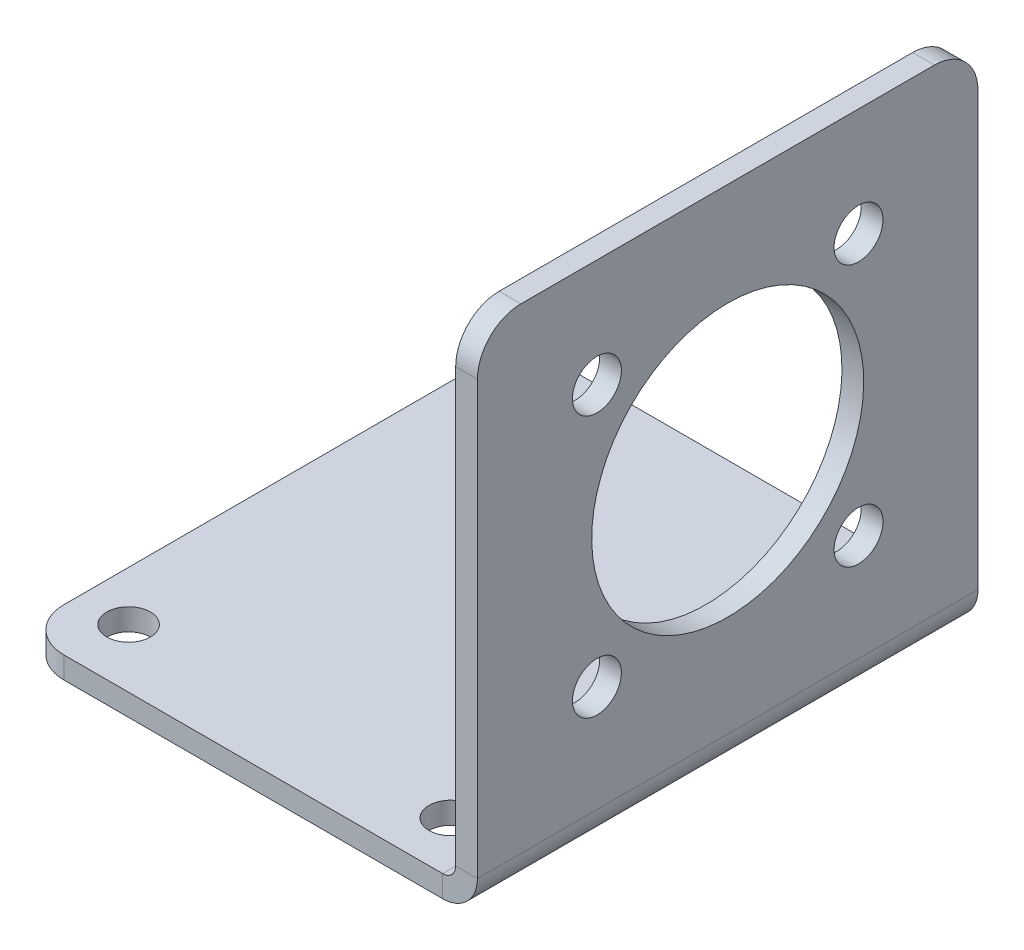
ISO-10303-21;
HEADER;
FILE_DESCRIPTION(('STEP AP214'),'2;1');
FILE_NAME('part.step','',(''),(''),'','','');
FILE_SCHEMA(('AUTOMOTIVE_DESIGN { 1 0 10303 214 1 1 1 1 }'));
ENDSEC;
DATA;
#1=APPLICATION_CONTEXT('core data for automotive mechanical design processes');
#2=APPLICATION_PROTOCOL_DEFINITION('international standard','automotive_design',2000,#1);
#3=PRODUCT_CONTEXT('',#1,'mechanical');
#4=PRODUCT('Part','Part','',(#3));
#5=PRODUCT_RELATED_PRODUCT_CATEGORY('part','',(#4));
#6=PRODUCT_DEFINITION_FORMATION('','',#4);
#7=PRODUCT_DEFINITION_CONTEXT('part definition',#1,'design');
#8=PRODUCT_DEFINITION('design','',#6,#7);
#9=PRODUCT_DEFINITION_SHAPE('','',#8);
#10=(LENGTH_UNIT() NAMED_UNIT(*) SI_UNIT(.MILLI.,.METRE.));
#11=(NAMED_UNIT(*) PLANE_ANGLE_UNIT() SI_UNIT($,.RADIAN.));
#12=(NAMED_UNIT(*) SI_UNIT($,.STERADIAN.) SOLID_ANGLE_UNIT());
#13=UNCERTAINTY_MEASURE_WITH_UNIT(LENGTH_MEASURE(1.E-05),#10,'distance_accuracy_value','');
#14=(GEOMETRIC_REPRESENTATION_CONTEXT(3) GLOBAL_UNCERTAINTY_ASSIGNED_CONTEXT((#13)) GLOBAL_UNIT_ASSIGNED_CONTEXT((#10,
#11,#12)) REPRESENTATION_CONTEXT('',''));
#15=CARTESIAN_POINT('',(0.,0.,0.));
#16=DIRECTION('',(0.,0.,1.));
#17=DIRECTION('',(1.,0.,0.));
#18=AXIS2_PLACEMENT_3D('',#15,#16,#17);
#19=CARTESIAN_POINT('',(20.0000000000001,-21.0557519189488,0.));
#20=DIRECTION('',(1.,0.,0.));
#21=DIRECTION('',(0.,0.,-1.));
#22=AXIS2_PLACEMENT_3D('',#19,#20,#21);
#23=PLANE('',#22);
#24=CARTESIAN_POINT('',(19.9999999999999,35.0208152801713,12.0208152801713));
#25=DIRECTION('',(1.,0.,0.));
#26=DIRECTION('',(0.,1.,0.));
#27=AXIS2_PLACEMENT_3D('',#24,#25,#26);
#28=CIRCLE('',#27,2.24999999999961);
#29=CARTESIAN_POINT('',(19.9999999999999,37.2708152801709,12.0208152801713));
#30=VERTEX_POINT('',#29);
#31=EDGE_CURVE('E336',#30,#30,#28,.T.);
#32=ORIENTED_EDGE('',*,*,#31,.T.);
#33=EDGE_LOOP('',(#32));
#34=FACE_BOUND('',#33,.T.);
#35=CARTESIAN_POINT('',(20.,10.9791847198287,12.0208152801713));
#36=DIRECTION('',(1.,0.,0.));
#37=DIRECTION('',(0.,1.,0.));
#38=AXIS2_PLACEMENT_3D('',#35,#36,#37);
#39=CIRCLE('',#38,2.24999999999793);
#40=CARTESIAN_POINT('',(20.,13.2291847198266,12.0208152801713));
#41=VERTEX_POINT('',#40);
#42=EDGE_CURVE('E310',#41,#41,#39,.T.);
#43=ORIENTED_EDGE('',*,*,#42,.T.);
#44=EDGE_LOOP('',(#43));
#45=FACE_BOUND('',#44,.T.);
#46=CARTESIAN_POINT('',(20.,10.9791847198287,-12.0208152801713));
#47=DIRECTION('',(1.,0.,0.));
#48=DIRECTION('',(0.,1.,0.));
#49=AXIS2_PLACEMENT_3D('',#46,#47,#48);
#50=CIRCLE('',#49,2.24999999999837);
#51=CARTESIAN_POINT('',(20.,13.2291847198271,-12.0208152801713));
#52=VERTEX_POINT('',#51);
#53=EDGE_CURVE('E305',#52,#52,#50,.T.);
#54=ORIENTED_EDGE('',*,*,#53,.T.);
#55=EDGE_LOOP('',(#54));
#56=FACE_BOUND('',#55,.T.);
#57=CARTESIAN_POINT('',(19.9999999999999,35.0208152801713,-12.0208152801713));
#58=DIRECTION('',(1.,0.,0.));
#59=DIRECTION('',(0.,1.,0.));
#60=AXIS2_PLACEMENT_3D('',#57,#58,#59);
#61=CIRCLE('',#60,2.24999999999994);
#62=CARTESIAN_POINT('',(19.9999999999999,37.2708152801713,-12.0208152801713));
#63=VERTEX_POINT('',#62);
#64=EDGE_CURVE('E298',#63,#63,#61,.T.);
#65=ORIENTED_EDGE('',*,*,#64,.T.);
#66=EDGE_LOOP('',(#65));
#67=FACE_BOUND('',#66,.T.);
#68=CARTESIAN_POINT('',(19.9999999999999,23.,0.));
#69=DIRECTION('',(1.,0.,0.));
#70=DIRECTION('',(0.,1.,0.));
#71=AXIS2_PLACEMENT_3D('',#68,#69,#70);
#72=CIRCLE('',#71,12.5);
#73=CARTESIAN_POINT('',(19.9999999999999,35.5,0.));
#74=VERTEX_POINT('',#73);
#75=EDGE_CURVE('E331',#74,#74,#72,.T.);
#76=ORIENTED_EDGE('',*,*,#75,.T.);
#77=EDGE_LOOP('',(#76));
#78=FACE_BOUND('',#77,.T.);
#79=DIRECTION('',(0.,0.,-1.));
#80=VECTOR('',#79,1.);
#81=CARTESIAN_POINT('',(19.9999999999999,44.9442480810512,-23.));
#82=LINE('',#81,#80);
#83=CARTESIAN_POINT('',(19.9999999999999,44.9442480810512,19.));
#84=VERTEX_POINT('',#83);
#85=CARTESIAN_POINT('',(19.9999999999999,44.9442480810512,-19.));
#86=VERTEX_POINT('',#85);
#87=EDGE_CURVE('E186',#84,#86,#82,.T.);
#88=ORIENTED_EDGE('',*,*,#87,.T.);
#89=CARTESIAN_POINT('',(19.9999999999999,40.9442480810512,-19.));
#90=DIRECTION('',(1.,0.,0.));
#91=DIRECTION('',(0.,1.,0.));
#92=AXIS2_PLACEMENT_3D('',#89,#90,#91);
#93=CIRCLE('',#92,4.);
#94=CARTESIAN_POINT('',(19.9999999999999,40.9442480810512,-23.));
#95=VERTEX_POINT('',#94);
#96=EDGE_CURVE('E264',#86,#95,#93,.F.);
#97=ORIENTED_EDGE('',*,*,#96,.T.);
#98=DIRECTION('',(0.,-1.,0.));
#99=VECTOR('',#98,1.);
#100=CARTESIAN_POINT('',(20.0000000000001,-41.0557519189488,-23.));
#101=LINE('',#100,#99);
#102=CARTESIAN_POINT('',(20.,1.2,-23.));
#103=VERTEX_POINT('',#102);
#104=EDGE_CURVE('E229',#95,#103,#101,.T.);
#105=ORIENTED_EDGE('',*,*,#104,.T.);
#106=DIRECTION('',(0.,0.,1.));
#107=VECTOR('',#106,1.);
#108=CARTESIAN_POINT('',(20.,1.2,0.));
#109=LINE('',#108,#107);
#110=CARTESIAN_POINT('',(20.,1.2,23.));
#111=VERTEX_POINT('',#110);
#112=EDGE_CURVE('E237',#103,#111,#109,.T.);
#113=ORIENTED_EDGE('',*,*,#112,.T.);
#114=DIRECTION('',(0.,1.,0.));
#115=VECTOR('',#114,1.);
#116=CARTESIAN_POINT('',(20.0000000000001,-41.0557519189488,23.));
#117=LINE('',#116,#115);
#118=CARTESIAN_POINT('',(19.9999999999999,40.9442480810512,23.));
#119=VERTEX_POINT('',#118);
#120=EDGE_CURVE('E246',#111,#119,#117,.T.);
#121=ORIENTED_EDGE('',*,*,#120,.T.);
#122=CARTESIAN_POINT('',(19.9999999999999,40.9442480810512,19.));
#123=DIRECTION('',(1.,0.,0.));
#124=DIRECTION('',(0.,1.,0.));
#125=AXIS2_PLACEMENT_3D('',#122,#123,#124);
#126=CIRCLE('',#125,4.);
#127=EDGE_CURVE('E261',#119,#84,#126,.F.);
#128=ORIENTED_EDGE('',*,*,#127,.T.);
#129=EDGE_LOOP('',(#88,#97,#105,#113,#121,#128));
#130=FACE_BOUND('',#129,.T.);
#131=ADVANCED_FACE('F61',(#34,#45,#56,#67,#78,#130),#23,.F.);
#132=CARTESIAN_POINT('',(22.0000000000002,-41.0557519189488,23.));
#133=DIRECTION('',(0.,0.,1.));
#134=DIRECTION('',(0.,1.,0.));
#135=AXIS2_PLACEMENT_3D('',#132,#133,#134);
#136=PLANE('',#135);
#137=DIRECTION('',(0.,1.,0.));
#138=VECTOR('',#137,1.);
#139=CARTESIAN_POINT('',(22.,-1.05575191894877,23.));
#140=LINE('',#139,#138);
#141=CARTESIAN_POINT('',(22.,1.20000000000001,23.));
#142=VERTEX_POINT('',#141);
#143=CARTESIAN_POINT('',(21.9999999999999,40.9442480810512,23.));
#144=VERTEX_POINT('',#143);
#145=EDGE_CURVE('E225',#142,#144,#140,.T.);
#146=ORIENTED_EDGE('',*,*,#145,.T.);
#147=DIRECTION('',(-1.,0.,0.));
#148=VECTOR('',#147,1.);
#149=CARTESIAN_POINT('',(21.9999999999999,40.9442480810512,23.));
#150=LINE('',#149,#148);
#151=EDGE_CURVE('E14',#144,#119,#150,.T.);
#152=ORIENTED_EDGE('',*,*,#151,.T.);
#153=ORIENTED_EDGE('',*,*,#120,.F.);
#154=DIRECTION('',(-1.,0.,0.));
#155=VECTOR('',#154,1.);
#156=CARTESIAN_POINT('',(22.,1.20000000000001,23.));
#157=LINE('',#156,#155);
#158=EDGE_CURVE('E233',#142,#111,#157,.T.);
#159=ORIENTED_EDGE('',*,*,#158,.F.);
#160=EDGE_LOOP('',(#146,#152,#153,#159));
#161=FACE_BOUND('',#160,.T.);
#162=ADVANCED_FACE('F365',(#161),#136,.T.);
#163=CARTESIAN_POINT('',(22.0000000000002,-41.0557519189488,-23.));
#164=DIRECTION('',(0.,0.,-1.));
#165=DIRECTION('',(0.,-1.,0.));
#166=AXIS2_PLACEMENT_3D('',#163,#164,#165);
#167=PLANE('',#166);
#168=ORIENTED_EDGE('',*,*,#104,.F.);
#169=DIRECTION('',(-1.,0.,0.));
#170=VECTOR('',#169,1.);
#171=CARTESIAN_POINT('',(21.9999999999999,40.9442480810512,-23.));
#172=LINE('',#171,#170);
#173=CARTESIAN_POINT('',(21.9999999999999,40.9442480810512,-23.));
#174=VERTEX_POINT('',#173);
#175=EDGE_CURVE('E267',#95,#174,#172,.F.);
#176=ORIENTED_EDGE('',*,*,#175,.T.);
#177=DIRECTION('',(0.,-1.,0.));
#178=VECTOR('',#177,1.);
#179=CARTESIAN_POINT('',(22.,-1.05575191894878,-23.));
#180=LINE('',#179,#178);
#181=CARTESIAN_POINT('',(22.,1.20000000000001,-23.));
#182=VERTEX_POINT('',#181);
#183=EDGE_CURVE('E224',#174,#182,#180,.T.);
#184=ORIENTED_EDGE('',*,*,#183,.T.);
#185=DIRECTION('',(1.,0.,0.));
#186=VECTOR('',#185,1.);
#187=CARTESIAN_POINT('',(22.,1.20000000000001,-23.));
#188=LINE('',#187,#186);
#189=EDGE_CURVE('E160',#103,#182,#188,.T.);
#190=ORIENTED_EDGE('',*,*,#189,.F.);
#191=EDGE_LOOP('',(#168,#176,#184,#190));
#192=FACE_BOUND('',#191,.T.);
#193=ADVANCED_FACE('F384',(#192),#167,.T.);
#194=CARTESIAN_POINT('',(21.9999999999999,44.9442480810512,-23.));
#195=DIRECTION('',(0.,1.,0.));
#196=DIRECTION('',(0.,0.,-1.));
#197=AXIS2_PLACEMENT_3D('',#194,#195,#196);
#198=PLANE('',#197);
#199=DIRECTION('',(0.,0.,-1.));
#200=VECTOR('',#199,1.);
#201=CARTESIAN_POINT('',(21.9999999999999,44.9442480810512,-23.));
#202=LINE('',#201,#200);
#203=CARTESIAN_POINT('',(21.9999999999999,44.9442480810512,19.));
#204=VERTEX_POINT('',#203);
#205=CARTESIAN_POINT('',(21.9999999999999,44.9442480810512,-19.));
#206=VERTEX_POINT('',#205);
#207=EDGE_CURVE('E220',#204,#206,#202,.T.);
#208=ORIENTED_EDGE('',*,*,#207,.T.);
#209=DIRECTION('',(-1.,0.,0.));
#210=VECTOR('',#209,1.);
#211=CARTESIAN_POINT('',(21.9999999999999,44.9442480810512,-19.));
#212=LINE('',#211,#210);
#213=EDGE_CURVE('E257',#206,#86,#212,.T.);
#214=ORIENTED_EDGE('',*,*,#213,.T.);
#215=ORIENTED_EDGE('',*,*,#87,.F.);
#216=DIRECTION('',(-1.,0.,0.));
#217=VECTOR('',#216,1.);
#218=CARTESIAN_POINT('',(21.9999999999999,44.9442480810512,19.));
#219=LINE('',#218,#217);
#220=EDGE_CURVE('E243',#84,#204,#219,.F.);
#221=ORIENTED_EDGE('',*,*,#220,.T.);
#222=EDGE_LOOP('',(#208,#214,#215,#221));
#223=FACE_BOUND('',#222,.T.);
#224=ADVANCED_FACE('F377',(#223),#198,.T.);
#225=CARTESIAN_POINT('',(22.0000000000001,-21.0557519189488,0.));
#226=DIRECTION('',(1.,0.,0.));
#227=DIRECTION('',(0.,0.,-1.));
#228=AXIS2_PLACEMENT_3D('',#225,#226,#227);
#229=PLANE('',#228);
#230=CARTESIAN_POINT('',(21.9999999999999,35.0208152801713,12.0208152801713));
#231=DIRECTION('',(1.,0.,0.));
#232=DIRECTION('',(0.,1.,0.));
#233=AXIS2_PLACEMENT_3D('',#230,#231,#232);
#234=CIRCLE('',#233,2.24999999999961);
#235=CARTESIAN_POINT('',(21.9999999999999,37.2708152801709,12.0208152801713));
#236=VERTEX_POINT('',#235);
#237=EDGE_CURVE('E340',#236,#236,#234,.T.);
#238=ORIENTED_EDGE('',*,*,#237,.F.);
#239=EDGE_LOOP('',(#238));
#240=FACE_BOUND('',#239,.T.);
#241=CARTESIAN_POINT('',(22.,10.9791847198287,12.0208152801713));
#242=DIRECTION('',(1.,0.,0.));
#243=DIRECTION('',(0.,1.,0.));
#244=AXIS2_PLACEMENT_3D('',#241,#242,#243);
#245=CIRCLE('',#244,2.24999999999793);
#246=CARTESIAN_POINT('',(22.,13.2291847198266,12.0208152801713));
#247=VERTEX_POINT('',#246);
#248=EDGE_CURVE('E334',#247,#247,#245,.T.);
#249=ORIENTED_EDGE('',*,*,#248,.F.);
#250=EDGE_LOOP('',(#249));
#251=FACE_BOUND('',#250,.T.);
#252=CARTESIAN_POINT('',(22.,10.9791847198287,-12.0208152801713));
#253=DIRECTION('',(1.,0.,0.));
#254=DIRECTION('',(0.,1.,0.));
#255=AXIS2_PLACEMENT_3D('',#252,#253,#254);
#256=CIRCLE('',#255,2.24999999999837);
#257=CARTESIAN_POINT('',(22.,13.2291847198271,-12.0208152801713));
#258=VERTEX_POINT('',#257);
#259=EDGE_CURVE('E308',#258,#258,#256,.T.);
#260=ORIENTED_EDGE('',*,*,#259,.F.);
#261=EDGE_LOOP('',(#260));
#262=FACE_BOUND('',#261,.T.);
#263=CARTESIAN_POINT('',(21.9999999999999,35.0208152801713,-12.0208152801713));
#264=DIRECTION('',(1.,0.,0.));
#265=DIRECTION('',(0.,1.,0.));
#266=AXIS2_PLACEMENT_3D('',#263,#264,#265);
#267=CIRCLE('',#266,2.24999999999994);
#268=CARTESIAN_POINT('',(21.9999999999999,37.2708152801713,-12.0208152801713));
#269=VERTEX_POINT('',#268);
#270=EDGE_CURVE('E301',#269,#269,#267,.T.);
#271=ORIENTED_EDGE('',*,*,#270,.F.);
#272=EDGE_LOOP('',(#271));
#273=FACE_BOUND('',#272,.T.);
#274=CARTESIAN_POINT('',(21.9999999999999,23.,0.));
#275=DIRECTION('',(1.,0.,0.));
#276=DIRECTION('',(0.,1.,0.));
#277=AXIS2_PLACEMENT_3D('',#274,#275,#276);
#278=CIRCLE('',#277,12.5);
#279=CARTESIAN_POINT('',(21.9999999999999,35.5,0.));
#280=VERTEX_POINT('',#279);
#281=EDGE_CURVE('E300',#280,#280,#278,.T.);
#282=ORIENTED_EDGE('',*,*,#281,.F.);
#283=EDGE_LOOP('',(#282));
#284=FACE_BOUND('',#283,.T.);
#285=ORIENTED_EDGE('',*,*,#183,.F.);
#286=CARTESIAN_POINT('',(21.9999999999999,40.9442480810512,-19.));
#287=DIRECTION('',(1.,0.,0.));
#288=DIRECTION('',(0.,1.,0.));
#289=AXIS2_PLACEMENT_3D('',#286,#287,#288);
#290=CIRCLE('',#289,4.);
#291=EDGE_CURVE('E273',#174,#206,#290,.T.);
#292=ORIENTED_EDGE('',*,*,#291,.T.);
#293=ORIENTED_EDGE('',*,*,#207,.F.);
#294=CARTESIAN_POINT('',(21.9999999999999,40.9442480810512,19.));
#295=DIRECTION('',(1.,0.,0.));
#296=DIRECTION('',(0.,1.,0.));
#297=AXIS2_PLACEMENT_3D('',#294,#295,#296);
#298=CIRCLE('',#297,4.);
#299=EDGE_CURVE('E270',#204,#144,#298,.T.);
#300=ORIENTED_EDGE('',*,*,#299,.T.);
#301=ORIENTED_EDGE('',*,*,#145,.F.);
#302=DIRECTION('',(0.,0.,1.));
#303=VECTOR('',#302,1.);
#304=CARTESIAN_POINT('',(22.,1.20000000000001,0.));
#305=LINE('',#304,#303);
#306=EDGE_CURVE('E230',#182,#142,#305,.T.);
#307=ORIENTED_EDGE('',*,*,#306,.F.);
#308=EDGE_LOOP('',(#285,#292,#293,#300,#301,#307));
#309=FACE_BOUND('',#308,.T.);
#310=ADVANCED_FACE('F370',(#240,#251,#262,#273,#284,#309),#229,.T.);
#311=CARTESIAN_POINT('',(-20.,-2.,-23.));
#312=DIRECTION('',(-1.,0.,0.));
#313=DIRECTION('',(0.,0.,1.));
#314=AXIS2_PLACEMENT_3D('',#311,#312,#313);
#315=PLANE('',#314);
#316=DIRECTION('',(0.,0.,1.));
#317=VECTOR('',#316,1.);
#318=CARTESIAN_POINT('',(-20.,0.,-23.));
#319=LINE('',#318,#317);
#320=CARTESIAN_POINT('',(-20.,0.,-19.));
#321=VERTEX_POINT('',#320);
#322=CARTESIAN_POINT('',(-20.,0.,19.));
#323=VERTEX_POINT('',#322);
#324=EDGE_CURVE('E199',#321,#323,#319,.T.);
#325=ORIENTED_EDGE('',*,*,#324,.F.);
#326=DIRECTION('',(0.,1.,0.));
#327=VECTOR('',#326,1.);
#328=CARTESIAN_POINT('',(-20.,-2.,-19.));
#329=LINE('',#328,#327);
#330=CARTESIAN_POINT('',(-20.,-2.,-19.));
#331=VERTEX_POINT('',#330);
#332=EDGE_CURVE('E289',#321,#331,#329,.F.);
#333=ORIENTED_EDGE('',*,*,#332,.T.);
#334=DIRECTION('',(0.,0.,1.));
#335=VECTOR('',#334,1.);
#336=CARTESIAN_POINT('',(-20.,-2.,-23.));
#337=LINE('',#336,#335);
#338=CARTESIAN_POINT('',(-20.,-2.,19.));
#339=VERTEX_POINT('',#338);
#340=EDGE_CURVE('E175',#331,#339,#337,.T.);
#341=ORIENTED_EDGE('',*,*,#340,.T.);
#342=DIRECTION('',(0.,1.,0.));
#343=VECTOR('',#342,1.);
#344=CARTESIAN_POINT('',(-20.,-2.,19.));
#345=LINE('',#344,#343);
#346=EDGE_CURVE('E285',#339,#323,#345,.T.);
#347=ORIENTED_EDGE('',*,*,#346,.T.);
#348=EDGE_LOOP('',(#325,#333,#341,#347));
#349=FACE_BOUND('',#348,.T.);
#350=ADVANCED_FACE('F401',(#349),#315,.T.);
#351=CARTESIAN_POINT('',(0.,-2.,0.));
#352=DIRECTION('',(0.,-1.,0.));
#353=DIRECTION('',(0.,0.,-1.));
#354=AXIS2_PLACEMENT_3D('',#351,#352,#353);
#355=PLANE('',#354);
#356=CARTESIAN_POINT('',(-15.4509429788929,-2.,17.6067880677596));
#357=DIRECTION('',(0.,1.,0.));
#358=DIRECTION('',(0.,0.,-1.));
#359=AXIS2_PLACEMENT_3D('',#356,#357,#358);
#360=CIRCLE('',#359,2.);
#361=CARTESIAN_POINT('',(-15.4509429788929,-2.,15.6067880677596));
#362=VERTEX_POINT('',#361);
#363=EDGE_CURVE('E729',#362,#362,#360,.T.);
#364=ORIENTED_EDGE('',*,*,#363,.T.);
#365=EDGE_LOOP('',(#364));
#366=FACE_BOUND('',#365,.T.);
#367=CARTESIAN_POINT('',(14.7497854283053,-2.,-18.1981992191248));
#368=DIRECTION('',(0.,1.,0.));
#369=DIRECTION('',(0.,0.,1.));
#370=AXIS2_PLACEMENT_3D('',#367,#368,#369);
#371=CIRCLE('',#370,2.);
#372=CARTESIAN_POINT('',(14.7497854283053,-2.,-16.1981992191248));
#373=VERTEX_POINT('',#372);
#374=EDGE_CURVE('E327',#373,#373,#371,.T.);
#375=ORIENTED_EDGE('',*,*,#374,.T.);
#376=EDGE_LOOP('',(#375));
#377=FACE_BOUND('',#376,.T.);
#378=CARTESIAN_POINT('',(14.7497854283053,-2.,18.1981992191248));
#379=DIRECTION('',(0.,1.,0.));
#380=DIRECTION('',(0.,0.,-1.));
#381=AXIS2_PLACEMENT_3D('',#378,#379,#380);
#382=CIRCLE('',#381,2.);
#383=CARTESIAN_POINT('',(14.7497854283053,-2.,16.1981992191248));
#384=VERTEX_POINT('',#383);
#385=EDGE_CURVE('E315',#384,#384,#382,.T.);
#386=ORIENTED_EDGE('',*,*,#385,.T.);
#387=EDGE_LOOP('',(#386));
#388=FACE_BOUND('',#387,.T.);
#389=CARTESIAN_POINT('',(-15.4509429788929,-2.,-17.6067880677596));
#390=DIRECTION('',(0.,1.,0.));
#391=DIRECTION('',(0.,0.,1.));
#392=AXIS2_PLACEMENT_3D('',#389,#390,#391);
#393=CIRCLE('',#392,2.);
#394=CARTESIAN_POINT('',(-15.4509429788929,-2.,-15.6067880677596));
#395=VERTEX_POINT('',#394);
#396=EDGE_CURVE('E346',#395,#395,#393,.T.);
#397=ORIENTED_EDGE('',*,*,#396,.T.);
#398=EDGE_LOOP('',(#397));
#399=FACE_BOUND('',#398,.T.);
#400=ORIENTED_EDGE('',*,*,#340,.F.);
#401=CARTESIAN_POINT('',(-16.,-2.,-19.));
#402=DIRECTION('',(0.,-1.,0.));
#403=DIRECTION('',(0.,0.,-1.));
#404=AXIS2_PLACEMENT_3D('',#401,#402,#403);
#405=CIRCLE('',#404,4.);
#406=CARTESIAN_POINT('',(-16.,-2.,-23.));
#407=VERTEX_POINT('',#406);
#408=EDGE_CURVE('E181',#331,#407,#405,.T.);
#409=ORIENTED_EDGE('',*,*,#408,.T.);
#410=DIRECTION('',(-1.,0.,0.));
#411=VECTOR('',#410,1.);
#412=CARTESIAN_POINT('',(20.,-2.,-23.));
#413=LINE('',#412,#411);
#414=CARTESIAN_POINT('',(18.8,-2.,-23.));
#415=VERTEX_POINT('',#414);
#416=EDGE_CURVE('E178',#415,#407,#413,.T.);
#417=ORIENTED_EDGE('',*,*,#416,.F.);
#418=DIRECTION('',(0.,0.,1.));
#419=VECTOR('',#418,1.);
#420=CARTESIAN_POINT('',(18.8,-2.,0.));
#421=LINE('',#420,#419);
#422=CARTESIAN_POINT('',(18.8,-2.,23.));
#423=VERTEX_POINT('',#422);
#424=EDGE_CURVE('E169',#415,#423,#421,.T.);
#425=ORIENTED_EDGE('',*,*,#424,.T.);
#426=DIRECTION('',(1.,0.,0.));
#427=VECTOR('',#426,1.);
#428=CARTESIAN_POINT('',(20.,-2.,23.));
#429=LINE('',#428,#427);
#430=CARTESIAN_POINT('',(-16.,-2.,23.));
#431=VERTEX_POINT('',#430);
#432=EDGE_CURVE('E174',#431,#423,#429,.T.);
#433=ORIENTED_EDGE('',*,*,#432,.F.);
#434=CARTESIAN_POINT('',(-16.,-2.,19.));
#435=DIRECTION('',(0.,-1.,0.));
#436=DIRECTION('',(0.,0.,-1.));
#437=AXIS2_PLACEMENT_3D('',#434,#435,#436);
#438=CIRCLE('',#437,4.);
#439=EDGE_CURVE('E83',#431,#339,#438,.T.);
#440=ORIENTED_EDGE('',*,*,#439,.T.);
#441=EDGE_LOOP('',(#400,#409,#417,#425,#433,#440));
#442=FACE_BOUND('',#441,.T.);
#443=ADVANCED_FACE('F179',(#366,#377,#388,#399,#442),#355,.T.);
#444=CARTESIAN_POINT('',(-20.,-2.,23.));
#445=DIRECTION('',(0.,0.,1.));
#446=DIRECTION('',(1.,0.,0.));
#447=AXIS2_PLACEMENT_3D('',#444,#445,#446);
#448=PLANE('',#447);
#449=DIRECTION('',(1.,0.,0.));
#450=VECTOR('',#449,1.);
#451=CARTESIAN_POINT('',(-20.,0.,23.));
#452=LINE('',#451,#450);
#453=CARTESIAN_POINT('',(-16.,0.,23.));
#454=VERTEX_POINT('',#453);
#455=CARTESIAN_POINT('',(18.8,0.,23.));
#456=VERTEX_POINT('',#455);
#457=EDGE_CURVE('E194',#454,#456,#452,.T.);
#458=ORIENTED_EDGE('',*,*,#457,.F.);
#459=DIRECTION('',(0.,1.,0.));
#460=VECTOR('',#459,1.);
#461=CARTESIAN_POINT('',(-16.,-2.,23.));
#462=LINE('',#461,#460);
#463=EDGE_CURVE('E70',#454,#431,#462,.F.);
#464=ORIENTED_EDGE('',*,*,#463,.T.);
#465=ORIENTED_EDGE('',*,*,#432,.T.);
#466=DIRECTION('',(0.,1.,0.));
#467=VECTOR('',#466,1.);
#468=CARTESIAN_POINT('',(18.8,-2.,23.));
#469=LINE('',#468,#467);
#470=EDGE_CURVE('E208',#423,#456,#469,.T.);
#471=ORIENTED_EDGE('',*,*,#470,.T.);
#472=EDGE_LOOP('',(#458,#464,#465,#471));
#473=FACE_BOUND('',#472,.T.);
#474=ADVANCED_FACE('F409',(#473),#448,.T.);
#475=CARTESIAN_POINT('',(0.,0.,0.));
#476=DIRECTION('',(0.,-1.,0.));
#477=DIRECTION('',(0.,0.,-1.));
#478=AXIS2_PLACEMENT_3D('',#475,#476,#477);
#479=PLANE('',#478);
#480=CARTESIAN_POINT('',(-15.4509429788929,0.,17.6067880677596));
#481=DIRECTION('',(0.,1.,0.));
#482=DIRECTION('',(0.,0.,-1.));
#483=AXIS2_PLACEMENT_3D('',#480,#481,#482);
#484=CIRCLE('',#483,2.);
#485=CARTESIAN_POINT('',(-15.4509429788929,0.,15.6067880677596));
#486=VERTEX_POINT('',#485);
#487=EDGE_CURVE('E735',#486,#486,#484,.T.);
#488=ORIENTED_EDGE('',*,*,#487,.F.);
#489=EDGE_LOOP('',(#488));
#490=FACE_BOUND('',#489,.T.);
#491=CARTESIAN_POINT('',(14.7497854283053,0.,-18.1981992191248));
#492=DIRECTION('',(0.,1.,0.));
#493=DIRECTION('',(0.,0.,1.));
#494=AXIS2_PLACEMENT_3D('',#491,#492,#493);
#495=CIRCLE('',#494,2.);
#496=CARTESIAN_POINT('',(14.7497854283053,0.,-16.1981992191248));
#497=VERTEX_POINT('',#496);
#498=EDGE_CURVE('E325',#497,#497,#495,.T.);
#499=ORIENTED_EDGE('',*,*,#498,.F.);
#500=EDGE_LOOP('',(#499));
#501=FACE_BOUND('',#500,.T.);
#502=CARTESIAN_POINT('',(14.7497854283053,0.,18.1981992191248));
#503=DIRECTION('',(0.,1.,0.));
#504=DIRECTION('',(0.,0.,-1.));
#505=AXIS2_PLACEMENT_3D('',#502,#503,#504);
#506=CIRCLE('',#505,2.);
#507=CARTESIAN_POINT('',(14.7497854283053,0.,16.1981992191248));
#508=VERTEX_POINT('',#507);
#509=EDGE_CURVE('E313',#508,#508,#506,.T.);
#510=ORIENTED_EDGE('',*,*,#509,.F.);
#511=EDGE_LOOP('',(#510));
#512=FACE_BOUND('',#511,.T.);
#513=CARTESIAN_POINT('',(-15.4509429788929,0.,-17.6067880677596));
#514=DIRECTION('',(0.,1.,0.));
#515=DIRECTION('',(0.,0.,1.));
#516=AXIS2_PLACEMENT_3D('',#513,#514,#515);
#517=CIRCLE('',#516,2.);
#518=CARTESIAN_POINT('',(-15.4509429788929,0.,-15.6067880677596));
#519=VERTEX_POINT('',#518);
#520=EDGE_CURVE('E473',#519,#519,#517,.T.);
#521=ORIENTED_EDGE('',*,*,#520,.F.);
#522=EDGE_LOOP('',(#521));
#523=FACE_BOUND('',#522,.T.);
#524=DIRECTION('',(-1.,0.,0.));
#525=VECTOR('',#524,1.);
#526=CARTESIAN_POINT('',(-20.,0.,-23.));
#527=LINE('',#526,#525);
#528=CARTESIAN_POINT('',(18.8,0.,-23.));
#529=VERTEX_POINT('',#528);
#530=CARTESIAN_POINT('',(-16.,0.,-23.));
#531=VERTEX_POINT('',#530);
#532=EDGE_CURVE('E191',#529,#531,#527,.T.);
#533=ORIENTED_EDGE('',*,*,#532,.T.);
#534=CARTESIAN_POINT('',(-16.,0.,-19.));
#535=DIRECTION('',(0.,-1.,0.));
#536=DIRECTION('',(0.,0.,-1.));
#537=AXIS2_PLACEMENT_3D('',#534,#535,#536);
#538=CIRCLE('',#537,4.);
#539=EDGE_CURVE('E282',#531,#321,#538,.F.);
#540=ORIENTED_EDGE('',*,*,#539,.T.);
#541=ORIENTED_EDGE('',*,*,#324,.T.);
#542=CARTESIAN_POINT('',(-16.,0.,19.));
#543=DIRECTION('',(0.,-1.,0.));
#544=DIRECTION('',(0.,0.,-1.));
#545=AXIS2_PLACEMENT_3D('',#542,#543,#544);
#546=CIRCLE('',#545,4.);
#547=EDGE_CURVE('E279',#323,#454,#546,.F.);
#548=ORIENTED_EDGE('',*,*,#547,.T.);
#549=ORIENTED_EDGE('',*,*,#457,.T.);
#550=DIRECTION('',(0.,0.,1.));
#551=VECTOR('',#550,1.);
#552=CARTESIAN_POINT('',(18.8,0.,0.));
#553=LINE('',#552,#551);
#554=EDGE_CURVE('E216',#529,#456,#553,.T.);
#555=ORIENTED_EDGE('',*,*,#554,.F.);
#556=EDGE_LOOP('',(#533,#540,#541,#548,#549,#555));
#557=FACE_BOUND('',#556,.T.);
#558=ADVANCED_FACE('F406',(#490,#501,#512,#523,#557),#479,.F.);
#559=CARTESIAN_POINT('',(-20.,-2.,-23.));
#560=DIRECTION('',(0.,0.,-1.));
#561=DIRECTION('',(-1.,0.,0.));
#562=AXIS2_PLACEMENT_3D('',#559,#560,#561);
#563=PLANE('',#562);
#564=ORIENTED_EDGE('',*,*,#416,.T.);
#565=DIRECTION('',(0.,1.,0.));
#566=VECTOR('',#565,1.);
#567=CARTESIAN_POINT('',(-16.,-2.,-23.));
#568=LINE('',#567,#566);
#569=EDGE_CURVE('E276',#407,#531,#568,.T.);
#570=ORIENTED_EDGE('',*,*,#569,.T.);
#571=ORIENTED_EDGE('',*,*,#532,.F.);
#572=DIRECTION('',(0.,-1.,0.));
#573=VECTOR('',#572,1.);
#574=CARTESIAN_POINT('',(18.8,-2.,-23.));
#575=LINE('',#574,#573);
#576=EDGE_CURVE('E157',#529,#415,#575,.T.);
#577=ORIENTED_EDGE('',*,*,#576,.T.);
#578=EDGE_LOOP('',(#564,#570,#571,#577));
#579=FACE_BOUND('',#578,.T.);
#580=ADVANCED_FACE('F189',(#579),#563,.T.);
#581=CARTESIAN_POINT('',(18.8,1.2,-23.));
#582=DIRECTION('',(0.,0.,-1.));
#583=DIRECTION('',(-1.,0.,0.));
#584=AXIS2_PLACEMENT_3D('',#581,#582,#583);
#585=PLANE('',#584);
#586=ORIENTED_EDGE('',*,*,#576,.F.);
#587=CARTESIAN_POINT('',(18.8,1.2,-23.));
#588=DIRECTION('',(0.,0.,1.));
#589=DIRECTION('',(1.,0.,0.));
#590=AXIS2_PLACEMENT_3D('',#587,#588,#589);
#591=CIRCLE('',#590,1.2);
#592=EDGE_CURVE('E322',#529,#103,#591,.T.);
#593=ORIENTED_EDGE('',*,*,#592,.T.);
#594=ORIENTED_EDGE('',*,*,#189,.T.);
#595=CARTESIAN_POINT('',(18.8,1.2,-23.));
#596=DIRECTION('',(0.,0.,1.));
#597=DIRECTION('',(-1.,0.,0.));
#598=AXIS2_PLACEMENT_3D('',#595,#596,#597);
#599=CIRCLE('',#598,3.2);
#600=EDGE_CURVE('E152',#415,#182,#599,.T.);
#601=ORIENTED_EDGE('',*,*,#600,.F.);
#602=EDGE_LOOP('',(#586,#593,#594,#601));
#603=FACE_BOUND('',#602,.T.);
#604=ADVANCED_FACE('F154',(#603),#585,.T.);
#605=CARTESIAN_POINT('',(18.8,1.2,23.));
#606=DIRECTION('',(0.,0.,1.));
#607=DIRECTION('',(1.,0.,0.));
#608=AXIS2_PLACEMENT_3D('',#605,#606,#607);
#609=PLANE('',#608);
#610=ORIENTED_EDGE('',*,*,#158,.T.);
#611=CARTESIAN_POINT('',(18.8,1.2,23.));
#612=DIRECTION('',(0.,0.,1.));
#613=DIRECTION('',(1.,0.,0.));
#614=AXIS2_PLACEMENT_3D('',#611,#612,#613);
#615=CIRCLE('',#614,1.2);
#616=EDGE_CURVE('E165',#111,#456,#615,.F.);
#617=ORIENTED_EDGE('',*,*,#616,.T.);
#618=ORIENTED_EDGE('',*,*,#470,.F.);
#619=CARTESIAN_POINT('',(18.8,1.2,23.));
#620=DIRECTION('',(0.,0.,-1.));
#621=DIRECTION('',(1.,0.,0.));
#622=AXIS2_PLACEMENT_3D('',#619,#620,#621);
#623=CIRCLE('',#622,3.2);
#624=EDGE_CURVE('E164',#142,#423,#623,.T.);
#625=ORIENTED_EDGE('',*,*,#624,.F.);
#626=EDGE_LOOP('',(#610,#617,#618,#625));
#627=FACE_BOUND('',#626,.T.);
#628=ADVANCED_FACE('F361',(#627),#609,.T.);
#629=CARTESIAN_POINT('',(18.8,1.2,-46.172959850169));
#630=DIRECTION('',(0.,0.,1.));
#631=DIRECTION('',(1.,0.,0.));
#632=AXIS2_PLACEMENT_3D('',#629,#630,#631);
#633=CYLINDRICAL_SURFACE('',#632,3.2);
#634=ORIENTED_EDGE('',*,*,#624,.T.);
#635=ORIENTED_EDGE('',*,*,#424,.F.);
#636=ORIENTED_EDGE('',*,*,#600,.T.);
#637=ORIENTED_EDGE('',*,*,#306,.T.);
#638=EDGE_LOOP('',(#634,#635,#636,#637));
#639=FACE_BOUND('',#638,.T.);
#640=ADVANCED_FACE('F171',(#639),#633,.T.);
#641=CARTESIAN_POINT('',(18.8,1.2,-46.172959850169));
#642=DIRECTION('',(0.,0.,1.));
#643=DIRECTION('',(1.,0.,0.));
#644=AXIS2_PLACEMENT_3D('',#641,#642,#643);
#645=CYLINDRICAL_SURFACE('',#644,1.2);
#646=ORIENTED_EDGE('',*,*,#616,.F.);
#647=ORIENTED_EDGE('',*,*,#112,.F.);
#648=ORIENTED_EDGE('',*,*,#592,.F.);
#649=ORIENTED_EDGE('',*,*,#554,.T.);
#650=EDGE_LOOP('',(#646,#647,#648,#649));
#651=FACE_BOUND('',#650,.T.);
#652=ADVANCED_FACE('F357',(#651),#645,.F.);
#653=CARTESIAN_POINT('',(19.9999999999999,23.,0.));
#654=DIRECTION('',(1.,0.,0.));
#655=DIRECTION('',(0.,1.,0.));
#656=AXIS2_PLACEMENT_3D('',#653,#654,#655);
#657=CYLINDRICAL_SURFACE('',#656,12.5);
#658=ORIENTED_EDGE('',*,*,#75,.F.);
#659=EDGE_LOOP('',(#658));
#660=FACE_BOUND('',#659,.T.);
#661=ORIENTED_EDGE('',*,*,#281,.T.);
#662=EDGE_LOOP('',(#661));
#663=FACE_BOUND('',#662,.T.);
#664=ADVANCED_FACE('F425',(#660,#663),#657,.F.);
#665=CARTESIAN_POINT('',(19.9999999999999,35.0208152801713,-12.0208152801713));
#666=DIRECTION('',(1.,0.,0.));
#667=DIRECTION('',(0.,1.,0.));
#668=AXIS2_PLACEMENT_3D('',#665,#666,#667);
#669=CYLINDRICAL_SURFACE('',#668,2.24999999999994);
#670=ORIENTED_EDGE('',*,*,#64,.F.);
#671=EDGE_LOOP('',(#670));
#672=FACE_BOUND('',#671,.T.);
#673=ORIENTED_EDGE('',*,*,#270,.T.);
#674=EDGE_LOOP('',(#673));
#675=FACE_BOUND('',#674,.T.);
#676=ADVANCED_FACE('F430',(#672,#675),#669,.F.);
#677=CARTESIAN_POINT('',(20.,10.9791847198287,-12.0208152801713));
#678=DIRECTION('',(1.,0.,0.));
#679=DIRECTION('',(0.,1.,0.));
#680=AXIS2_PLACEMENT_3D('',#677,#678,#679);
#681=CYLINDRICAL_SURFACE('',#680,2.24999999999837);
#682=ORIENTED_EDGE('',*,*,#53,.F.);
#683=EDGE_LOOP('',(#682));
#684=FACE_BOUND('',#683,.T.);
#685=ORIENTED_EDGE('',*,*,#259,.T.);
#686=EDGE_LOOP('',(#685));
#687=FACE_BOUND('',#686,.T.);
#688=ADVANCED_FACE('F440',(#684,#687),#681,.F.);
#689=CARTESIAN_POINT('',(20.,10.9791847198287,12.0208152801713));
#690=DIRECTION('',(1.,0.,0.));
#691=DIRECTION('',(0.,1.,0.));
#692=AXIS2_PLACEMENT_3D('',#689,#690,#691);
#693=CYLINDRICAL_SURFACE('',#692,2.24999999999793);
#694=ORIENTED_EDGE('',*,*,#42,.F.);
#695=EDGE_LOOP('',(#694));
#696=FACE_BOUND('',#695,.T.);
#697=ORIENTED_EDGE('',*,*,#248,.T.);
#698=EDGE_LOOP('',(#697));
#699=FACE_BOUND('',#698,.T.);
#700=ADVANCED_FACE('F436',(#696,#699),#693,.F.);
#701=CARTESIAN_POINT('',(19.9999999999999,35.0208152801713,12.0208152801713));
#702=DIRECTION('',(1.,0.,0.));
#703=DIRECTION('',(0.,1.,0.));
#704=AXIS2_PLACEMENT_3D('',#701,#702,#703);
#705=CYLINDRICAL_SURFACE('',#704,2.24999999999961);
#706=ORIENTED_EDGE('',*,*,#31,.F.);
#707=EDGE_LOOP('',(#706));
#708=FACE_BOUND('',#707,.T.);
#709=ORIENTED_EDGE('',*,*,#237,.T.);
#710=EDGE_LOOP('',(#709));
#711=FACE_BOUND('',#710,.T.);
#712=ADVANCED_FACE('F432',(#708,#711),#705,.F.);
#713=CARTESIAN_POINT('',(-15.4509429788929,-2.,-17.6067880677596));
#714=DIRECTION('',(0.,1.,0.));
#715=DIRECTION('',(0.,0.,1.));
#716=AXIS2_PLACEMENT_3D('',#713,#714,#715);
#717=CYLINDRICAL_SURFACE('',#716,2.);
#718=ORIENTED_EDGE('',*,*,#396,.F.);
#719=EDGE_LOOP('',(#718));
#720=FACE_BOUND('',#719,.T.);
#721=ORIENTED_EDGE('',*,*,#520,.T.);
#722=EDGE_LOOP('',(#721));
#723=FACE_BOUND('',#722,.T.);
#724=ADVANCED_FACE('F435',(#720,#723),#717,.F.);
#725=CARTESIAN_POINT('',(14.7497854283053,-2.,18.1981992191248));
#726=DIRECTION('',(0.,1.,0.));
#727=DIRECTION('',(0.,0.,1.));
#728=AXIS2_PLACEMENT_3D('',#725,#726,#727);
#729=CYLINDRICAL_SURFACE('',#728,2.);
#730=ORIENTED_EDGE('',*,*,#385,.F.);
#731=EDGE_LOOP('',(#730));
#732=FACE_BOUND('',#731,.T.);
#733=ORIENTED_EDGE('',*,*,#509,.T.);
#734=EDGE_LOOP('',(#733));
#735=FACE_BOUND('',#734,.T.);
#736=ADVANCED_FACE('F450',(#732,#735),#729,.F.);
#737=CARTESIAN_POINT('',(14.7497854283053,-2.,-18.1981992191248));
#738=DIRECTION('',(0.,1.,0.));
#739=DIRECTION('',(0.,0.,1.));
#740=AXIS2_PLACEMENT_3D('',#737,#738,#739);
#741=CYLINDRICAL_SURFACE('',#740,2.);
#742=ORIENTED_EDGE('',*,*,#374,.F.);
#743=EDGE_LOOP('',(#742));
#744=FACE_BOUND('',#743,.T.);
#745=ORIENTED_EDGE('',*,*,#498,.T.);
#746=EDGE_LOOP('',(#745));
#747=FACE_BOUND('',#746,.T.);
#748=ADVANCED_FACE('F452',(#744,#747),#741,.F.);
#749=CARTESIAN_POINT('',(-15.4509429788929,-2.,17.6067880677596));
#750=DIRECTION('',(0.,1.,0.));
#751=DIRECTION('',(0.,0.,1.));
#752=AXIS2_PLACEMENT_3D('',#749,#750,#751);
#753=CYLINDRICAL_SURFACE('',#752,2.);
#754=ORIENTED_EDGE('',*,*,#363,.F.);
#755=EDGE_LOOP('',(#754));
#756=FACE_BOUND('',#755,.T.);
#757=ORIENTED_EDGE('',*,*,#487,.T.);
#758=EDGE_LOOP('',(#757));
#759=FACE_BOUND('',#758,.T.);
#760=ADVANCED_FACE('F455',(#756,#759),#753,.F.);
#761=CARTESIAN_POINT('',(21.9999999999999,40.9442480810512,-19.));
#762=DIRECTION('',(-1.,0.,0.));
#763=DIRECTION('',(0.,-1.,0.));
#764=AXIS2_PLACEMENT_3D('',#761,#762,#763);
#765=CYLINDRICAL_SURFACE('',#764,4.);
#766=ORIENTED_EDGE('',*,*,#291,.F.);
#767=ORIENTED_EDGE('',*,*,#175,.F.);
#768=ORIENTED_EDGE('',*,*,#96,.F.);
#769=ORIENTED_EDGE('',*,*,#213,.F.);
#770=EDGE_LOOP('',(#766,#767,#768,#769));
#771=FACE_BOUND('',#770,.T.);
#772=ADVANCED_FACE('F381',(#771),#765,.T.);
#773=CARTESIAN_POINT('',(-16.,-2.,-19.));
#774=DIRECTION('',(0.,1.,0.));
#775=DIRECTION('',(0.,0.,1.));
#776=AXIS2_PLACEMENT_3D('',#773,#774,#775);
#777=CYLINDRICAL_SURFACE('',#776,4.);
#778=ORIENTED_EDGE('',*,*,#408,.F.);
#779=ORIENTED_EDGE('',*,*,#332,.F.);
#780=ORIENTED_EDGE('',*,*,#539,.F.);
#781=ORIENTED_EDGE('',*,*,#569,.F.);
#782=EDGE_LOOP('',(#778,#779,#780,#781));
#783=FACE_BOUND('',#782,.T.);
#784=ADVANCED_FACE('F480',(#783),#777,.T.);
#785=CARTESIAN_POINT('',(-16.,-2.,19.));
#786=DIRECTION('',(0.,1.,0.));
#787=DIRECTION('',(0.,0.,1.));
#788=AXIS2_PLACEMENT_3D('',#785,#786,#787);
#789=CYLINDRICAL_SURFACE('',#788,4.);
#790=ORIENTED_EDGE('',*,*,#439,.F.);
#791=ORIENTED_EDGE('',*,*,#463,.F.);
#792=ORIENTED_EDGE('',*,*,#547,.F.);
#793=ORIENTED_EDGE('',*,*,#346,.F.);
#794=EDGE_LOOP('',(#790,#791,#792,#793));
#795=FACE_BOUND('',#794,.T.);
#796=ADVANCED_FACE('F476',(#795),#789,.T.);
#797=CARTESIAN_POINT('',(21.9999999999999,40.9442480810512,19.));
#798=DIRECTION('',(-1.,0.,0.));
#799=DIRECTION('',(0.,-1.,0.));
#800=AXIS2_PLACEMENT_3D('',#797,#798,#799);
#801=CYLINDRICAL_SURFACE('',#800,4.);
#802=ORIENTED_EDGE('',*,*,#299,.F.);
#803=ORIENTED_EDGE('',*,*,#220,.F.);
#804=ORIENTED_EDGE('',*,*,#127,.F.);
#805=ORIENTED_EDGE('',*,*,#151,.F.);
#806=EDGE_LOOP('',(#802,#803,#804,#805));
#807=FACE_BOUND('',#806,.T.);
#808=ADVANCED_FACE('F63',(#807),#801,.T.);
#809=CLOSED_SHELL('',(#131,#162,#193,#224,#310,#350,#443,#474,#558,#580,#604,#628,#640,#652,
#664,#676,#688,#700,#712,#724,#736,#748,#760,#772,#784,#796,#808));
#810=MANIFOLD_SOLID_BREP('B2',#809);
#811=ADVANCED_BREP_SHAPE_REPRESENTATION('',(#18,#810),#14);
#812=SHAPE_DEFINITION_REPRESENTATION(#9,#811);
ENDSEC;
END-ISO-10303-21;
